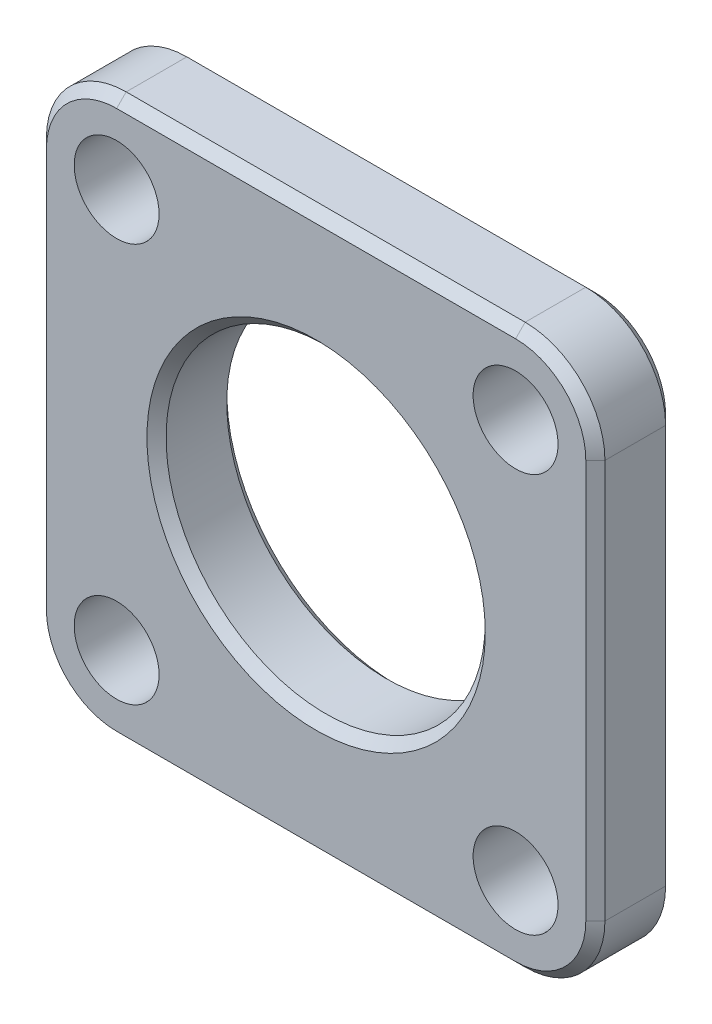
ISO-10303-21;
HEADER;
FILE_DESCRIPTION(('STEP AP214'),'2;1');
FILE_NAME('part.step','',(''),(''),'','','');
FILE_SCHEMA(('AUTOMOTIVE_DESIGN { 1 0 10303 214 1 1 1 1 }'));
ENDSEC;
DATA;
#1=APPLICATION_CONTEXT('core data for automotive mechanical design processes');
#2=APPLICATION_PROTOCOL_DEFINITION('international standard','automotive_design',2000,#1);
#3=PRODUCT_CONTEXT('',#1,'mechanical');
#4=PRODUCT('Part','Part','',(#3));
#5=PRODUCT_RELATED_PRODUCT_CATEGORY('part','',(#4));
#6=PRODUCT_DEFINITION_FORMATION('','',#4);
#7=PRODUCT_DEFINITION_CONTEXT('part definition',#1,'design');
#8=PRODUCT_DEFINITION('design','',#6,#7);
#9=PRODUCT_DEFINITION_SHAPE('','',#8);
#10=(LENGTH_UNIT() NAMED_UNIT(*) SI_UNIT(.MILLI.,.METRE.));
#11=(NAMED_UNIT(*) PLANE_ANGLE_UNIT() SI_UNIT($,.RADIAN.));
#12=(NAMED_UNIT(*) SI_UNIT($,.STERADIAN.) SOLID_ANGLE_UNIT());
#13=UNCERTAINTY_MEASURE_WITH_UNIT(LENGTH_MEASURE(1.E-05),#10,'distance_accuracy_value','');
#14=(GEOMETRIC_REPRESENTATION_CONTEXT(3) GLOBAL_UNCERTAINTY_ASSIGNED_CONTEXT((#13)) GLOBAL_UNIT_ASSIGNED_CONTEXT((#10,
#11,#12)) REPRESENTATION_CONTEXT('',''));
#15=CARTESIAN_POINT('',(0.,0.,0.));
#16=DIRECTION('',(0.,0.,1.));
#17=DIRECTION('',(1.,0.,0.));
#18=AXIS2_PLACEMENT_3D('',#15,#16,#17);
#19=CARTESIAN_POINT('',(0.,0.,-6.35));
#20=DIRECTION('',(0.,0.,1.));
#21=DIRECTION('',(1.,0.,0.));
#22=AXIS2_PLACEMENT_3D('',#19,#20,#21);
#23=PLANE('',#22);
#24=CARTESIAN_POINT('',(15.875,-15.875,-6.35));
#25=DIRECTION('',(0.,0.,1.));
#26=DIRECTION('',(1.,0.,0.));
#27=AXIS2_PLACEMENT_3D('',#24,#25,#26);
#28=CIRCLE('',#27,3.3782);
#29=CARTESIAN_POINT('',(19.2532,-15.875,-6.35));
#30=VERTEX_POINT('',#29);
#31=EDGE_CURVE('E392',#30,#30,#28,.T.);
#32=ORIENTED_EDGE('',*,*,#31,.T.);
#33=EDGE_LOOP('',(#32));
#34=FACE_BOUND('',#33,.T.);
#35=CARTESIAN_POINT('',(15.875,15.875,-6.35));
#36=DIRECTION('',(0.,0.,1.));
#37=DIRECTION('',(1.,0.,0.));
#38=AXIS2_PLACEMENT_3D('',#35,#36,#37);
#39=CIRCLE('',#38,3.3782);
#40=CARTESIAN_POINT('',(19.2532,15.875,-6.35));
#41=VERTEX_POINT('',#40);
#42=EDGE_CURVE('E256',#41,#41,#39,.F.);
#43=ORIENTED_EDGE('',*,*,#42,.F.);
#44=EDGE_LOOP('',(#43));
#45=FACE_BOUND('',#44,.T.);
#46=DIRECTION('',(0.,-1.,0.));
#47=VECTOR('',#46,1.);
#48=CARTESIAN_POINT('',(21.463,-15.875,-6.35));
#49=LINE('',#48,#47);
#50=CARTESIAN_POINT('',(21.463,15.875,-6.35));
#51=VERTEX_POINT('',#50);
#52=CARTESIAN_POINT('',(21.463,-15.875,-6.35));
#53=VERTEX_POINT('',#52);
#54=EDGE_CURVE('E175',#51,#53,#49,.T.);
#55=ORIENTED_EDGE('',*,*,#54,.T.);
#56=CARTESIAN_POINT('',(15.875,-15.875,-6.35));
#57=DIRECTION('',(0.,0.,1.));
#58=DIRECTION('',(1.,0.,0.));
#59=AXIS2_PLACEMENT_3D('',#56,#57,#58);
#60=CIRCLE('',#59,5.58799999999999);
#61=CARTESIAN_POINT('',(15.875,-21.463,-6.35));
#62=VERTEX_POINT('',#61);
#63=EDGE_CURVE('E156',#53,#62,#60,.F.);
#64=ORIENTED_EDGE('',*,*,#63,.T.);
#65=DIRECTION('',(-1.,0.,0.));
#66=VECTOR('',#65,1.);
#67=CARTESIAN_POINT('',(-15.875,-21.463,-6.35));
#68=LINE('',#67,#66);
#69=CARTESIAN_POINT('',(-15.875,-21.463,-6.35));
#70=VERTEX_POINT('',#69);
#71=EDGE_CURVE('E164',#62,#70,#68,.T.);
#72=ORIENTED_EDGE('',*,*,#71,.T.);
#73=CARTESIAN_POINT('',(-15.875,-15.875,-6.35));
#74=DIRECTION('',(0.,0.,1.));
#75=DIRECTION('',(1.,0.,0.));
#76=AXIS2_PLACEMENT_3D('',#73,#74,#75);
#77=CIRCLE('',#76,5.58799999999998);
#78=CARTESIAN_POINT('',(-21.463,-15.875,-6.35));
#79=VERTEX_POINT('',#78);
#80=EDGE_CURVE('E170',#70,#79,#77,.F.);
#81=ORIENTED_EDGE('',*,*,#80,.T.);
#82=DIRECTION('',(0.,1.,0.));
#83=VECTOR('',#82,1.);
#84=CARTESIAN_POINT('',(-21.463,15.875,-6.35));
#85=LINE('',#84,#83);
#86=CARTESIAN_POINT('',(-21.463,15.875,-6.35));
#87=VERTEX_POINT('',#86);
#88=EDGE_CURVE('E319',#79,#87,#85,.T.);
#89=ORIENTED_EDGE('',*,*,#88,.T.);
#90=CARTESIAN_POINT('',(-15.875,15.875,-6.35));
#91=DIRECTION('',(0.,0.,1.));
#92=DIRECTION('',(1.,0.,0.));
#93=AXIS2_PLACEMENT_3D('',#90,#91,#92);
#94=CIRCLE('',#93,5.58799999999999);
#95=CARTESIAN_POINT('',(-15.875,21.463,-6.35));
#96=VERTEX_POINT('',#95);
#97=EDGE_CURVE('E321',#87,#96,#94,.F.);
#98=ORIENTED_EDGE('',*,*,#97,.T.);
#99=DIRECTION('',(1.,0.,0.));
#100=VECTOR('',#99,1.);
#101=CARTESIAN_POINT('',(15.875,21.463,-6.35));
#102=LINE('',#101,#100);
#103=CARTESIAN_POINT('',(15.875,21.463,-6.35));
#104=VERTEX_POINT('',#103);
#105=EDGE_CURVE('E323',#96,#104,#102,.T.);
#106=ORIENTED_EDGE('',*,*,#105,.T.);
#107=CARTESIAN_POINT('',(15.875,15.875,-6.35));
#108=DIRECTION('',(0.,0.,1.));
#109=DIRECTION('',(1.,0.,0.));
#110=AXIS2_PLACEMENT_3D('',#107,#108,#109);
#111=CIRCLE('',#110,5.58799999999998);
#112=EDGE_CURVE('E180',#104,#51,#111,.F.);
#113=ORIENTED_EDGE('',*,*,#112,.T.);
#114=EDGE_LOOP('',(#55,#64,#72,#81,#89,#98,#106,#113));
#115=FACE_BOUND('',#114,.T.);
#116=CARTESIAN_POINT('',(0.,0.,-6.35));
#117=DIRECTION('',(0.,0.,1.));
#118=DIRECTION('',(1.,0.,0.));
#119=AXIS2_PLACEMENT_3D('',#116,#117,#118);
#120=CIRCLE('',#119,13.462);
#121=CARTESIAN_POINT('',(13.462,0.,-6.35));
#122=VERTEX_POINT('',#121);
#123=EDGE_CURVE('E171',#122,#122,#120,.T.);
#124=ORIENTED_EDGE('',*,*,#123,.T.);
#125=EDGE_LOOP('',(#124));
#126=FACE_BOUND('',#125,.T.);
#127=CARTESIAN_POINT('',(-15.875,-15.875,-6.35));
#128=DIRECTION('',(0.,0.,1.));
#129=DIRECTION('',(1.,0.,0.));
#130=AXIS2_PLACEMENT_3D('',#127,#128,#129);
#131=CIRCLE('',#130,3.3782);
#132=CARTESIAN_POINT('',(-12.4968,-15.875,-6.35));
#133=VERTEX_POINT('',#132);
#134=EDGE_CURVE('E386',#133,#133,#131,.F.);
#135=ORIENTED_EDGE('',*,*,#134,.F.);
#136=EDGE_LOOP('',(#135));
#137=FACE_BOUND('',#136,.T.);
#138=CARTESIAN_POINT('',(-15.875,15.875,-6.35));
#139=DIRECTION('',(0.,0.,1.));
#140=DIRECTION('',(1.,0.,0.));
#141=AXIS2_PLACEMENT_3D('',#138,#139,#140);
#142=CIRCLE('',#141,3.3782);
#143=CARTESIAN_POINT('',(-12.4968,15.875,-6.35));
#144=VERTEX_POINT('',#143);
#145=EDGE_CURVE('E380',#144,#144,#142,.T.);
#146=ORIENTED_EDGE('',*,*,#145,.T.);
#147=EDGE_LOOP('',(#146));
#148=FACE_BOUND('',#147,.T.);
#149=ADVANCED_FACE('F38',(#34,#45,#115,#126,#137,#148),#23,.F.);
#150=CARTESIAN_POINT('',(0.,0.,0.));
#151=DIRECTION('',(0.,0.,1.));
#152=DIRECTION('',(1.,0.,0.));
#153=AXIS2_PLACEMENT_3D('',#150,#151,#152);
#154=PLANE('',#153);
#155=CARTESIAN_POINT('',(-15.875,-15.875,0.));
#156=DIRECTION('',(0.,0.,1.));
#157=DIRECTION('',(1.,0.,0.));
#158=AXIS2_PLACEMENT_3D('',#155,#156,#157);
#159=CIRCLE('',#158,3.3782);
#160=CARTESIAN_POINT('',(-12.4968,-15.875,0.));
#161=VERTEX_POINT('',#160);
#162=EDGE_CURVE('E389',#161,#161,#159,.F.);
#163=ORIENTED_EDGE('',*,*,#162,.T.);
#164=EDGE_LOOP('',(#163));
#165=FACE_BOUND('',#164,.T.);
#166=CARTESIAN_POINT('',(15.875,15.875,0.));
#167=DIRECTION('',(0.,0.,1.));
#168=DIRECTION('',(1.,0.,0.));
#169=AXIS2_PLACEMENT_3D('',#166,#167,#168);
#170=CIRCLE('',#169,3.3782);
#171=CARTESIAN_POINT('',(19.2532,15.875,0.));
#172=VERTEX_POINT('',#171);
#173=EDGE_CURVE('E374',#172,#172,#170,.F.);
#174=ORIENTED_EDGE('',*,*,#173,.T.);
#175=EDGE_LOOP('',(#174));
#176=FACE_BOUND('',#175,.T.);
#177=DIRECTION('',(-1.,0.,0.));
#178=VECTOR('',#177,1.);
#179=CARTESIAN_POINT('',(0.,21.463,0.));
#180=LINE('',#179,#178);
#181=CARTESIAN_POINT('',(15.875,21.463,0.));
#182=VERTEX_POINT('',#181);
#183=CARTESIAN_POINT('',(-15.875,21.463,0.));
#184=VERTEX_POINT('',#183);
#185=EDGE_CURVE('E47',#182,#184,#180,.T.);
#186=ORIENTED_EDGE('',*,*,#185,.T.);
#187=CARTESIAN_POINT('',(-15.875,15.875,0.));
#188=DIRECTION('',(0.,0.,1.));
#189=DIRECTION('',(1.,0.,0.));
#190=AXIS2_PLACEMENT_3D('',#187,#188,#189);
#191=CIRCLE('',#190,5.588);
#192=CARTESIAN_POINT('',(-21.463,15.875,0.));
#193=VERTEX_POINT('',#192);
#194=EDGE_CURVE('E12',#184,#193,#191,.T.);
#195=ORIENTED_EDGE('',*,*,#194,.T.);
#196=DIRECTION('',(0.,-1.,0.));
#197=VECTOR('',#196,1.);
#198=CARTESIAN_POINT('',(-21.463,0.,0.));
#199=LINE('',#198,#197);
#200=CARTESIAN_POINT('',(-21.463,-15.875,0.));
#201=VERTEX_POINT('',#200);
#202=EDGE_CURVE('E223',#193,#201,#199,.T.);
#203=ORIENTED_EDGE('',*,*,#202,.T.);
#204=CARTESIAN_POINT('',(-15.875,-15.875,0.));
#205=DIRECTION('',(0.,0.,1.));
#206=DIRECTION('',(1.,0.,0.));
#207=AXIS2_PLACEMENT_3D('',#204,#205,#206);
#208=CIRCLE('',#207,5.58799999999999);
#209=CARTESIAN_POINT('',(-15.875,-21.463,0.));
#210=VERTEX_POINT('',#209);
#211=EDGE_CURVE('E225',#201,#210,#208,.T.);
#212=ORIENTED_EDGE('',*,*,#211,.T.);
#213=DIRECTION('',(1.,0.,0.));
#214=VECTOR('',#213,1.);
#215=CARTESIAN_POINT('',(0.,-21.463,0.));
#216=LINE('',#215,#214);
#217=CARTESIAN_POINT('',(15.875,-21.463,0.));
#218=VERTEX_POINT('',#217);
#219=EDGE_CURVE('E227',#210,#218,#216,.T.);
#220=ORIENTED_EDGE('',*,*,#219,.T.);
#221=CARTESIAN_POINT('',(15.875,-15.875,0.));
#222=DIRECTION('',(0.,0.,1.));
#223=DIRECTION('',(1.,0.,0.));
#224=AXIS2_PLACEMENT_3D('',#221,#222,#223);
#225=CIRCLE('',#224,5.588);
#226=CARTESIAN_POINT('',(21.463,-15.875,0.));
#227=VERTEX_POINT('',#226);
#228=EDGE_CURVE('E229',#218,#227,#225,.T.);
#229=ORIENTED_EDGE('',*,*,#228,.T.);
#230=DIRECTION('',(0.,1.,0.));
#231=VECTOR('',#230,1.);
#232=CARTESIAN_POINT('',(21.463,0.,0.));
#233=LINE('',#232,#231);
#234=CARTESIAN_POINT('',(21.463,15.875,0.));
#235=VERTEX_POINT('',#234);
#236=EDGE_CURVE('E231',#227,#235,#233,.T.);
#237=ORIENTED_EDGE('',*,*,#236,.T.);
#238=CARTESIAN_POINT('',(15.875,15.875,0.));
#239=DIRECTION('',(0.,0.,1.));
#240=DIRECTION('',(1.,0.,0.));
#241=AXIS2_PLACEMENT_3D('',#238,#239,#240);
#242=CIRCLE('',#241,5.58799999999999);
#243=EDGE_CURVE('E58',#235,#182,#242,.T.);
#244=ORIENTED_EDGE('',*,*,#243,.T.);
#245=EDGE_LOOP('',(#186,#195,#203,#212,#220,#229,#237,#244));
#246=FACE_BOUND('',#245,.T.);
#247=CARTESIAN_POINT('',(0.,0.,0.));
#248=DIRECTION('',(0.,0.,1.));
#249=DIRECTION('',(1.,0.,0.));
#250=AXIS2_PLACEMENT_3D('',#247,#248,#249);
#251=CIRCLE('',#250,13.462);
#252=CARTESIAN_POINT('',(13.462,0.,0.));
#253=VERTEX_POINT('',#252);
#254=EDGE_CURVE('E220',#253,#253,#251,.F.);
#255=ORIENTED_EDGE('',*,*,#254,.T.);
#256=EDGE_LOOP('',(#255));
#257=FACE_BOUND('',#256,.T.);
#258=CARTESIAN_POINT('',(15.875,-15.875,0.));
#259=DIRECTION('',(0.,0.,1.));
#260=DIRECTION('',(1.,0.,0.));
#261=AXIS2_PLACEMENT_3D('',#258,#259,#260);
#262=CIRCLE('',#261,3.3782);
#263=CARTESIAN_POINT('',(19.2532,-15.875,0.));
#264=VERTEX_POINT('',#263);
#265=EDGE_CURVE('E377',#264,#264,#262,.T.);
#266=ORIENTED_EDGE('',*,*,#265,.F.);
#267=EDGE_LOOP('',(#266));
#268=FACE_BOUND('',#267,.T.);
#269=CARTESIAN_POINT('',(-15.875,15.875,0.));
#270=DIRECTION('',(0.,0.,1.));
#271=DIRECTION('',(1.,0.,0.));
#272=AXIS2_PLACEMENT_3D('',#269,#270,#271);
#273=CIRCLE('',#272,3.3782);
#274=CARTESIAN_POINT('',(-12.4968,15.875,0.));
#275=VERTEX_POINT('',#274);
#276=EDGE_CURVE('E383',#275,#275,#273,.T.);
#277=ORIENTED_EDGE('',*,*,#276,.F.);
#278=EDGE_LOOP('',(#277));
#279=FACE_BOUND('',#278,.T.);
#280=ADVANCED_FACE('F352',(#165,#176,#246,#257,#268,#279),#154,.T.);
#281=CARTESIAN_POINT('',(-22.225,-22.225,-6.35));
#282=DIRECTION('',(-1.,0.,0.));
#283=DIRECTION('',(0.,0.,1.));
#284=AXIS2_PLACEMENT_3D('',#281,#282,#283);
#285=PLANE('',#284);
#286=DIRECTION('',(0.,0.,1.));
#287=VECTOR('',#286,1.);
#288=CARTESIAN_POINT('',(-22.225,15.875,-6.35));
#289=LINE('',#288,#287);
#290=CARTESIAN_POINT('',(-22.225,15.875,-0.762000000000013));
#291=VERTEX_POINT('',#290);
#292=CARTESIAN_POINT('',(-22.225,15.875,-5.58799999999999));
#293=VERTEX_POINT('',#292);
#294=EDGE_CURVE('E252',#291,#293,#289,.F.);
#295=ORIENTED_EDGE('',*,*,#294,.T.);
#296=DIRECTION('',(0.,-1.,0.));
#297=VECTOR('',#296,1.);
#298=CARTESIAN_POINT('',(-22.225,-15.875,-5.58799999999999));
#299=LINE('',#298,#297);
#300=CARTESIAN_POINT('',(-22.225,-15.875,-5.58799999999999));
#301=VERTEX_POINT('',#300);
#302=EDGE_CURVE('E204',#293,#301,#299,.T.);
#303=ORIENTED_EDGE('',*,*,#302,.T.);
#304=DIRECTION('',(0.,0.,1.));
#305=VECTOR('',#304,1.);
#306=CARTESIAN_POINT('',(-22.225,-15.875,-6.35));
#307=LINE('',#306,#305);
#308=CARTESIAN_POINT('',(-22.225,-15.875,-0.762000000000013));
#309=VERTEX_POINT('',#308);
#310=EDGE_CURVE('E299',#301,#309,#307,.T.);
#311=ORIENTED_EDGE('',*,*,#310,.T.);
#312=DIRECTION('',(0.,1.,0.));
#313=VECTOR('',#312,1.);
#314=CARTESIAN_POINT('',(-22.225,-22.225,-0.762000000000013));
#315=LINE('',#314,#313);
#316=EDGE_CURVE('E202',#309,#291,#315,.T.);
#317=ORIENTED_EDGE('',*,*,#316,.T.);
#318=EDGE_LOOP('',(#295,#303,#311,#317));
#319=FACE_BOUND('',#318,.T.);
#320=ADVANCED_FACE('F366',(#319),#285,.T.);
#321=CARTESIAN_POINT('',(22.225,22.225,-6.35));
#322=DIRECTION('',(0.,1.,0.));
#323=DIRECTION('',(-1.,0.,0.));
#324=AXIS2_PLACEMENT_3D('',#321,#322,#323);
#325=PLANE('',#324);
#326=DIRECTION('',(0.,0.,1.));
#327=VECTOR('',#326,1.);
#328=CARTESIAN_POINT('',(15.875,22.225,-6.35));
#329=LINE('',#328,#327);
#330=CARTESIAN_POINT('',(15.875,22.225,-0.762000000000013));
#331=VERTEX_POINT('',#330);
#332=CARTESIAN_POINT('',(15.875,22.225,-5.58799999999999));
#333=VERTEX_POINT('',#332);
#334=EDGE_CURVE('E301',#331,#333,#329,.F.);
#335=ORIENTED_EDGE('',*,*,#334,.T.);
#336=DIRECTION('',(-1.,0.,0.));
#337=VECTOR('',#336,1.);
#338=CARTESIAN_POINT('',(-15.875,22.225,-5.58799999999999));
#339=LINE('',#338,#337);
#340=CARTESIAN_POINT('',(-15.875,22.225,-5.58799999999999));
#341=VERTEX_POINT('',#340);
#342=EDGE_CURVE('E195',#333,#341,#339,.T.);
#343=ORIENTED_EDGE('',*,*,#342,.T.);
#344=DIRECTION('',(0.,0.,1.));
#345=VECTOR('',#344,1.);
#346=CARTESIAN_POINT('',(-15.875,22.225,-6.35));
#347=LINE('',#346,#345);
#348=CARTESIAN_POINT('',(-15.875,22.225,-0.762000000000013));
#349=VERTEX_POINT('',#348);
#350=EDGE_CURVE('E309',#341,#349,#347,.T.);
#351=ORIENTED_EDGE('',*,*,#350,.T.);
#352=DIRECTION('',(1.,0.,0.));
#353=VECTOR('',#352,1.);
#354=CARTESIAN_POINT('',(22.225,22.225,-0.762000000000013));
#355=LINE('',#354,#353);
#356=EDGE_CURVE('E193',#349,#331,#355,.T.);
#357=ORIENTED_EDGE('',*,*,#356,.T.);
#358=EDGE_LOOP('',(#335,#343,#351,#357));
#359=FACE_BOUND('',#358,.T.);
#360=ADVANCED_FACE('F427',(#359),#325,.T.);
#361=CARTESIAN_POINT('',(22.225,-22.225,-6.35));
#362=DIRECTION('',(1.,0.,0.));
#363=DIRECTION('',(0.,0.,-1.));
#364=AXIS2_PLACEMENT_3D('',#361,#362,#363);
#365=PLANE('',#364);
#366=DIRECTION('',(0.,0.,1.));
#367=VECTOR('',#366,1.);
#368=CARTESIAN_POINT('',(22.225,-15.875,-6.35));
#369=LINE('',#368,#367);
#370=CARTESIAN_POINT('',(22.225,-15.875,-0.762000000000013));
#371=VERTEX_POINT('',#370);
#372=CARTESIAN_POINT('',(22.225,-15.875,-5.58799999999999));
#373=VERTEX_POINT('',#372);
#374=EDGE_CURVE('E293',#371,#373,#369,.F.);
#375=ORIENTED_EDGE('',*,*,#374,.T.);
#376=DIRECTION('',(0.,1.,0.));
#377=VECTOR('',#376,1.);
#378=CARTESIAN_POINT('',(22.225,15.875,-5.58799999999999));
#379=LINE('',#378,#377);
#380=CARTESIAN_POINT('',(22.225,15.875,-5.58799999999999));
#381=VERTEX_POINT('',#380);
#382=EDGE_CURVE('E187',#373,#381,#379,.T.);
#383=ORIENTED_EDGE('',*,*,#382,.T.);
#384=DIRECTION('',(0.,0.,1.));
#385=VECTOR('',#384,1.);
#386=CARTESIAN_POINT('',(22.225,15.875,-6.35));
#387=LINE('',#386,#385);
#388=CARTESIAN_POINT('',(22.225,15.875,-0.762000000000013));
#389=VERTEX_POINT('',#388);
#390=EDGE_CURVE('E312',#381,#389,#387,.T.);
#391=ORIENTED_EDGE('',*,*,#390,.T.);
#392=DIRECTION('',(0.,-1.,0.));
#393=VECTOR('',#392,1.);
#394=CARTESIAN_POINT('',(22.225,-22.225,-0.762000000000013));
#395=LINE('',#394,#393);
#396=EDGE_CURVE('E185',#389,#371,#395,.T.);
#397=ORIENTED_EDGE('',*,*,#396,.T.);
#398=EDGE_LOOP('',(#375,#383,#391,#397));
#399=FACE_BOUND('',#398,.T.);
#400=ADVANCED_FACE('F336',(#399),#365,.T.);
#401=CARTESIAN_POINT('',(22.225,-22.225,-6.35));
#402=DIRECTION('',(0.,-1.,0.));
#403=DIRECTION('',(1.,0.,0.));
#404=AXIS2_PLACEMENT_3D('',#401,#402,#403);
#405=PLANE('',#404);
#406=DIRECTION('',(0.,0.,1.));
#407=VECTOR('',#406,1.);
#408=CARTESIAN_POINT('',(-15.875,-22.225,-6.35));
#409=LINE('',#408,#407);
#410=CARTESIAN_POINT('',(-15.875,-22.225,-0.762000000000013));
#411=VERTEX_POINT('',#410);
#412=CARTESIAN_POINT('',(-15.875,-22.225,-5.58799999999999));
#413=VERTEX_POINT('',#412);
#414=EDGE_CURVE('E298',#411,#413,#409,.F.);
#415=ORIENTED_EDGE('',*,*,#414,.T.);
#416=DIRECTION('',(1.,0.,0.));
#417=VECTOR('',#416,1.);
#418=CARTESIAN_POINT('',(15.875,-22.225,-5.58799999999999));
#419=LINE('',#418,#417);
#420=CARTESIAN_POINT('',(15.875,-22.225,-5.58799999999999));
#421=VERTEX_POINT('',#420);
#422=EDGE_CURVE('E212',#413,#421,#419,.T.);
#423=ORIENTED_EDGE('',*,*,#422,.T.);
#424=DIRECTION('',(0.,0.,1.));
#425=VECTOR('',#424,1.);
#426=CARTESIAN_POINT('',(15.875,-22.225,-6.35));
#427=LINE('',#426,#425);
#428=CARTESIAN_POINT('',(15.875,-22.225,-0.762000000000013));
#429=VERTEX_POINT('',#428);
#430=EDGE_CURVE('E291',#421,#429,#427,.T.);
#431=ORIENTED_EDGE('',*,*,#430,.T.);
#432=DIRECTION('',(-1.,0.,0.));
#433=VECTOR('',#432,1.);
#434=CARTESIAN_POINT('',(22.225,-22.225,-0.762000000000013));
#435=LINE('',#434,#433);
#436=EDGE_CURVE('E210',#429,#411,#435,.T.);
#437=ORIENTED_EDGE('',*,*,#436,.T.);
#438=EDGE_LOOP('',(#415,#423,#431,#437));
#439=FACE_BOUND('',#438,.T.);
#440=ADVANCED_FACE('F296',(#439),#405,.T.);
#441=CARTESIAN_POINT('',(0.,0.,-6.35));
#442=DIRECTION('',(0.,0.,1.));
#443=DIRECTION('',(1.,0.,0.));
#444=AXIS2_PLACEMENT_3D('',#441,#442,#443);
#445=CYLINDRICAL_SURFACE('',#444,12.7);
#446=CARTESIAN_POINT('',(0.,0.,-5.58799999999999));
#447=DIRECTION('',(0.,0.,1.));
#448=DIRECTION('',(1.,0.,0.));
#449=AXIS2_PLACEMENT_3D('',#446,#447,#448);
#450=CIRCLE('',#449,12.7);
#451=CARTESIAN_POINT('',(12.7,0.,-5.58799999999999));
#452=VERTEX_POINT('',#451);
#453=EDGE_CURVE('E217',#452,#452,#450,.F.);
#454=ORIENTED_EDGE('',*,*,#453,.T.);
#455=EDGE_LOOP('',(#454));
#456=FACE_BOUND('',#455,.T.);
#457=CARTESIAN_POINT('',(0.,0.,-0.762000000000006));
#458=DIRECTION('',(0.,0.,1.));
#459=DIRECTION('',(1.,0.,0.));
#460=AXIS2_PLACEMENT_3D('',#457,#458,#459);
#461=CIRCLE('',#460,12.7);
#462=CARTESIAN_POINT('',(12.7,0.,-0.762000000000006));
#463=VERTEX_POINT('',#462);
#464=EDGE_CURVE('E214',#463,#463,#461,.T.);
#465=ORIENTED_EDGE('',*,*,#464,.T.);
#466=EDGE_LOOP('',(#465));
#467=FACE_BOUND('',#466,.T.);
#468=ADVANCED_FACE('F425',(#456,#467),#445,.F.);
#469=CARTESIAN_POINT('',(-15.875,-15.875,-6.35));
#470=DIRECTION('',(0.,0.,1.));
#471=DIRECTION('',(1.,0.,0.));
#472=AXIS2_PLACEMENT_3D('',#469,#470,#471);
#473=CYLINDRICAL_SURFACE('',#472,6.35);
#474=ORIENTED_EDGE('',*,*,#310,.F.);
#475=CARTESIAN_POINT('',(-15.875,-15.875,-5.58799999999999));
#476=DIRECTION('',(0.,0.,1.));
#477=DIRECTION('',(1.,0.,0.));
#478=AXIS2_PLACEMENT_3D('',#475,#476,#477);
#479=CIRCLE('',#478,6.35);
#480=EDGE_CURVE('E208',#301,#413,#479,.T.);
#481=ORIENTED_EDGE('',*,*,#480,.T.);
#482=ORIENTED_EDGE('',*,*,#414,.F.);
#483=CARTESIAN_POINT('',(-15.875,-15.875,-0.762000000000013));
#484=DIRECTION('',(0.,0.,1.));
#485=DIRECTION('',(1.,0.,0.));
#486=AXIS2_PLACEMENT_3D('',#483,#484,#485);
#487=CIRCLE('',#486,6.35);
#488=EDGE_CURVE('E206',#411,#309,#487,.F.);
#489=ORIENTED_EDGE('',*,*,#488,.T.);
#490=EDGE_LOOP('',(#474,#481,#482,#489));
#491=FACE_BOUND('',#490,.T.);
#492=ADVANCED_FACE('F437',(#491),#473,.T.);
#493=CARTESIAN_POINT('',(-15.875,15.875,-6.35));
#494=DIRECTION('',(0.,0.,1.));
#495=DIRECTION('',(1.,0.,0.));
#496=AXIS2_PLACEMENT_3D('',#493,#494,#495);
#497=CYLINDRICAL_SURFACE('',#496,6.35);
#498=ORIENTED_EDGE('',*,*,#350,.F.);
#499=CARTESIAN_POINT('',(-15.875,15.875,-5.58799999999999));
#500=DIRECTION('',(0.,0.,1.));
#501=DIRECTION('',(1.,0.,0.));
#502=AXIS2_PLACEMENT_3D('',#499,#500,#501);
#503=CIRCLE('',#502,6.35);
#504=EDGE_CURVE('E200',#341,#293,#503,.T.);
#505=ORIENTED_EDGE('',*,*,#504,.T.);
#506=ORIENTED_EDGE('',*,*,#294,.F.);
#507=CARTESIAN_POINT('',(-15.875,15.875,-0.762000000000013));
#508=DIRECTION('',(0.,0.,1.));
#509=DIRECTION('',(1.,0.,0.));
#510=AXIS2_PLACEMENT_3D('',#507,#508,#509);
#511=CIRCLE('',#510,6.35);
#512=EDGE_CURVE('E197',#291,#349,#511,.F.);
#513=ORIENTED_EDGE('',*,*,#512,.T.);
#514=EDGE_LOOP('',(#498,#505,#506,#513));
#515=FACE_BOUND('',#514,.T.);
#516=ADVANCED_FACE('F371',(#515),#497,.T.);
#517=CARTESIAN_POINT('',(15.875,-15.875,-6.35));
#518=DIRECTION('',(0.,0.,1.));
#519=DIRECTION('',(1.,0.,0.));
#520=AXIS2_PLACEMENT_3D('',#517,#518,#519);
#521=CYLINDRICAL_SURFACE('',#520,6.35);
#522=ORIENTED_EDGE('',*,*,#430,.F.);
#523=CARTESIAN_POINT('',(15.875,-15.875,-5.58799999999999));
#524=DIRECTION('',(0.,0.,1.));
#525=DIRECTION('',(1.,0.,0.));
#526=AXIS2_PLACEMENT_3D('',#523,#524,#525);
#527=CIRCLE('',#526,6.35);
#528=EDGE_CURVE('E158',#421,#373,#527,.T.);
#529=ORIENTED_EDGE('',*,*,#528,.T.);
#530=ORIENTED_EDGE('',*,*,#374,.F.);
#531=CARTESIAN_POINT('',(15.875,-15.875,-0.762000000000013));
#532=DIRECTION('',(0.,0.,1.));
#533=DIRECTION('',(1.,0.,0.));
#534=AXIS2_PLACEMENT_3D('',#531,#532,#533);
#535=CIRCLE('',#534,6.35);
#536=EDGE_CURVE('E177',#371,#429,#535,.F.);
#537=ORIENTED_EDGE('',*,*,#536,.T.);
#538=EDGE_LOOP('',(#522,#529,#530,#537));
#539=FACE_BOUND('',#538,.T.);
#540=ADVANCED_FACE('F290',(#539),#521,.T.);
#541=CARTESIAN_POINT('',(15.875,15.875,-6.35));
#542=DIRECTION('',(0.,0.,1.));
#543=DIRECTION('',(1.,0.,0.));
#544=AXIS2_PLACEMENT_3D('',#541,#542,#543);
#545=CYLINDRICAL_SURFACE('',#544,6.35);
#546=ORIENTED_EDGE('',*,*,#390,.F.);
#547=CARTESIAN_POINT('',(15.875,15.875,-5.58799999999999));
#548=DIRECTION('',(0.,0.,1.));
#549=DIRECTION('',(1.,0.,0.));
#550=AXIS2_PLACEMENT_3D('',#547,#548,#549);
#551=CIRCLE('',#550,6.35);
#552=EDGE_CURVE('E191',#381,#333,#551,.T.);
#553=ORIENTED_EDGE('',*,*,#552,.T.);
#554=ORIENTED_EDGE('',*,*,#334,.F.);
#555=CARTESIAN_POINT('',(15.875,15.875,-0.762000000000013));
#556=DIRECTION('',(0.,0.,1.));
#557=DIRECTION('',(1.,0.,0.));
#558=AXIS2_PLACEMENT_3D('',#555,#556,#557);
#559=CIRCLE('',#558,6.35);
#560=EDGE_CURVE('E189',#331,#389,#559,.F.);
#561=ORIENTED_EDGE('',*,*,#560,.T.);
#562=EDGE_LOOP('',(#546,#553,#554,#561));
#563=FACE_BOUND('',#562,.T.);
#564=ADVANCED_FACE('F338',(#563),#545,.T.);
#565=CARTESIAN_POINT('',(-15.875,15.875,-6.35));
#566=DIRECTION('',(0.,0.,1.));
#567=DIRECTION('',(1.,0.,0.));
#568=AXIS2_PLACEMENT_3D('',#565,#566,#567);
#569=CONICAL_SURFACE('',#568,5.58799999999999,0.785398163397452);
#570=DIRECTION('',(0.707106781186551,0.,-0.707106781186544));
#571=VECTOR('',#570,1.);
#572=CARTESIAN_POINT('',(-22.225,15.875,-5.58799999999999));
#573=LINE('',#572,#571);
#574=EDGE_CURVE('E246',#293,#87,#573,.T.);
#575=ORIENTED_EDGE('',*,*,#574,.F.);
#576=ORIENTED_EDGE('',*,*,#504,.F.);
#577=DIRECTION('',(0.,0.707106781186551,0.707106781186544));
#578=VECTOR('',#577,1.);
#579=CARTESIAN_POINT('',(-15.875,21.463,-6.35));
#580=LINE('',#579,#578);
#581=EDGE_CURVE('E249',#96,#341,#580,.T.);
#582=ORIENTED_EDGE('',*,*,#581,.F.);
#583=ORIENTED_EDGE('',*,*,#97,.F.);
#584=EDGE_LOOP('',(#575,#576,#582,#583));
#585=FACE_BOUND('',#584,.T.);
#586=ADVANCED_FACE('F447',(#585),#569,.T.);
#587=CARTESIAN_POINT('',(22.225,22.225,-5.58799999999999));
#588=DIRECTION('',(0.,0.707106781186544,-0.707106781186551));
#589=DIRECTION('',(1.,0.,0.));
#590=AXIS2_PLACEMENT_3D('',#587,#588,#589);
#591=PLANE('',#590);
#592=ORIENTED_EDGE('',*,*,#581,.T.);
#593=ORIENTED_EDGE('',*,*,#342,.F.);
#594=DIRECTION('',(0.,0.707106781186551,0.707106781186544));
#595=VECTOR('',#594,1.);
#596=CARTESIAN_POINT('',(15.875,21.463,-6.35));
#597=LINE('',#596,#595);
#598=EDGE_CURVE('E243',#104,#333,#597,.T.);
#599=ORIENTED_EDGE('',*,*,#598,.F.);
#600=ORIENTED_EDGE('',*,*,#105,.F.);
#601=EDGE_LOOP('',(#592,#593,#599,#600));
#602=FACE_BOUND('',#601,.T.);
#603=ADVANCED_FACE('F464',(#602),#591,.T.);
#604=CARTESIAN_POINT('',(-22.225,-22.225,-5.58799999999999));
#605=DIRECTION('',(-0.707106781186544,0.,-0.707106781186551));
#606=DIRECTION('',(0.,1.,0.));
#607=AXIS2_PLACEMENT_3D('',#604,#605,#606);
#608=PLANE('',#607);
#609=ORIENTED_EDGE('',*,*,#574,.T.);
#610=ORIENTED_EDGE('',*,*,#88,.F.);
#611=DIRECTION('',(0.707106781186551,0.,-0.707106781186544));
#612=VECTOR('',#611,1.);
#613=CARTESIAN_POINT('',(-22.225,-15.875,-5.58799999999999));
#614=LINE('',#613,#612);
#615=EDGE_CURVE('E240',#301,#79,#614,.T.);
#616=ORIENTED_EDGE('',*,*,#615,.F.);
#617=ORIENTED_EDGE('',*,*,#302,.F.);
#618=EDGE_LOOP('',(#609,#610,#616,#617));
#619=FACE_BOUND('',#618,.T.);
#620=ADVANCED_FACE('F461',(#619),#608,.T.);
#621=CARTESIAN_POINT('',(15.875,15.875,-6.35));
#622=DIRECTION('',(0.,0.,1.));
#623=DIRECTION('',(1.,0.,0.));
#624=AXIS2_PLACEMENT_3D('',#621,#622,#623);
#625=CONICAL_SURFACE('',#624,5.58799999999998,0.785398163397454);
#626=ORIENTED_EDGE('',*,*,#598,.T.);
#627=ORIENTED_EDGE('',*,*,#552,.F.);
#628=DIRECTION('',(0.707106781186551,0.,0.707106781186544));
#629=VECTOR('',#628,1.);
#630=CARTESIAN_POINT('',(21.463,15.875,-6.35));
#631=LINE('',#630,#629);
#632=EDGE_CURVE('E237',#51,#381,#631,.T.);
#633=ORIENTED_EDGE('',*,*,#632,.F.);
#634=ORIENTED_EDGE('',*,*,#112,.F.);
#635=EDGE_LOOP('',(#626,#627,#633,#634));
#636=FACE_BOUND('',#635,.T.);
#637=ADVANCED_FACE('F330',(#636),#625,.T.);
#638=CARTESIAN_POINT('',(-15.875,-15.875,-6.35));
#639=DIRECTION('',(0.,0.,1.));
#640=DIRECTION('',(1.,0.,0.));
#641=AXIS2_PLACEMENT_3D('',#638,#639,#640);
#642=CONICAL_SURFACE('',#641,5.58799999999998,0.785398163397454);
#643=ORIENTED_EDGE('',*,*,#615,.T.);
#644=ORIENTED_EDGE('',*,*,#80,.F.);
#645=DIRECTION('',(0.,0.707106781186552,-0.707106781186543));
#646=VECTOR('',#645,1.);
#647=CARTESIAN_POINT('',(-15.875,-22.225,-5.58799999999999));
#648=LINE('',#647,#646);
#649=EDGE_CURVE('E167',#413,#70,#648,.T.);
#650=ORIENTED_EDGE('',*,*,#649,.F.);
#651=ORIENTED_EDGE('',*,*,#480,.F.);
#652=EDGE_LOOP('',(#643,#644,#650,#651));
#653=FACE_BOUND('',#652,.T.);
#654=ADVANCED_FACE('F455',(#653),#642,.T.);
#655=CARTESIAN_POINT('',(22.225,-22.225,-5.58799999999999));
#656=DIRECTION('',(0.707106781186544,0.,-0.707106781186551));
#657=DIRECTION('',(0.,-1.,0.));
#658=AXIS2_PLACEMENT_3D('',#655,#656,#657);
#659=PLANE('',#658);
#660=ORIENTED_EDGE('',*,*,#632,.T.);
#661=ORIENTED_EDGE('',*,*,#382,.F.);
#662=DIRECTION('',(0.707106781186551,0.,0.707106781186544));
#663=VECTOR('',#662,1.);
#664=CARTESIAN_POINT('',(21.463,-15.875,-6.35));
#665=LINE('',#664,#663);
#666=EDGE_CURVE('E161',#53,#373,#665,.T.);
#667=ORIENTED_EDGE('',*,*,#666,.F.);
#668=ORIENTED_EDGE('',*,*,#54,.F.);
#669=EDGE_LOOP('',(#660,#661,#667,#668));
#670=FACE_BOUND('',#669,.T.);
#671=ADVANCED_FACE('F333',(#670),#659,.T.);
#672=CARTESIAN_POINT('',(22.225,-22.225,-5.58799999999999));
#673=DIRECTION('',(0.,-0.707106781186544,-0.707106781186551));
#674=DIRECTION('',(-1.,0.,0.));
#675=AXIS2_PLACEMENT_3D('',#672,#673,#674);
#676=PLANE('',#675);
#677=ORIENTED_EDGE('',*,*,#649,.T.);
#678=ORIENTED_EDGE('',*,*,#71,.F.);
#679=DIRECTION('',(0.,0.707106781186549,-0.707106781186546));
#680=VECTOR('',#679,1.);
#681=CARTESIAN_POINT('',(15.875,-22.225,-5.58799999999999));
#682=LINE('',#681,#680);
#683=EDGE_CURVE('E152',#421,#62,#682,.T.);
#684=ORIENTED_EDGE('',*,*,#683,.F.);
#685=ORIENTED_EDGE('',*,*,#422,.F.);
#686=EDGE_LOOP('',(#677,#678,#684,#685));
#687=FACE_BOUND('',#686,.T.);
#688=ADVANCED_FACE('F165',(#687),#676,.T.);
#689=CARTESIAN_POINT('',(15.875,-15.875,-6.35));
#690=DIRECTION('',(0.,0.,1.));
#691=DIRECTION('',(1.,0.,0.));
#692=AXIS2_PLACEMENT_3D('',#689,#690,#691);
#693=CONICAL_SURFACE('',#692,5.58799999999999,0.785398163397452);
#694=ORIENTED_EDGE('',*,*,#666,.T.);
#695=ORIENTED_EDGE('',*,*,#528,.F.);
#696=ORIENTED_EDGE('',*,*,#683,.T.);
#697=ORIENTED_EDGE('',*,*,#63,.F.);
#698=EDGE_LOOP('',(#694,#695,#696,#697));
#699=FACE_BOUND('',#698,.T.);
#700=ADVANCED_FACE('F154',(#699),#693,.T.);
#701=CARTESIAN_POINT('',(0.,0.,-6.35));
#702=DIRECTION('',(0.,0.,-1.));
#703=DIRECTION('',(-1.,0.,0.));
#704=AXIS2_PLACEMENT_3D('',#701,#702,#703);
#705=CONICAL_SURFACE('',#704,13.462,0.785398163397445);
#706=ORIENTED_EDGE('',*,*,#453,.F.);
#707=EDGE_LOOP('',(#706));
#708=FACE_BOUND('',#707,.T.);
#709=ORIENTED_EDGE('',*,*,#123,.F.);
#710=EDGE_LOOP('',(#709));
#711=FACE_BOUND('',#710,.T.);
#712=ADVANCED_FACE('F450',(#708,#711),#705,.F.);
#713=CARTESIAN_POINT('',(15.875,-15.875,0.));
#714=DIRECTION('',(0.,0.,-1.));
#715=DIRECTION('',(-1.,0.,0.));
#716=AXIS2_PLACEMENT_3D('',#713,#714,#715);
#717=CONICAL_SURFACE('',#716,5.588,0.785398163397443);
#718=DIRECTION('',(0.,0.707106781186544,0.707106781186551));
#719=VECTOR('',#718,1.);
#720=CARTESIAN_POINT('',(15.875,-22.225,-0.762000000000013));
#721=LINE('',#720,#719);
#722=EDGE_CURVE('E269',#429,#218,#721,.T.);
#723=ORIENTED_EDGE('',*,*,#722,.F.);
#724=ORIENTED_EDGE('',*,*,#536,.F.);
#725=DIRECTION('',(0.707106781186544,0.,-0.707106781186551));
#726=VECTOR('',#725,1.);
#727=CARTESIAN_POINT('',(21.463,-15.875,0.));
#728=LINE('',#727,#726);
#729=EDGE_CURVE('E42',#227,#371,#728,.T.);
#730=ORIENTED_EDGE('',*,*,#729,.F.);
#731=ORIENTED_EDGE('',*,*,#228,.F.);
#732=EDGE_LOOP('',(#723,#724,#730,#731));
#733=FACE_BOUND('',#732,.T.);
#734=ADVANCED_FACE('F285',(#733),#717,.T.);
#735=CARTESIAN_POINT('',(21.463,0.,0.));
#736=DIRECTION('',(-0.707106781186551,0.,-0.707106781186544));
#737=DIRECTION('',(0.,1.,0.));
#738=AXIS2_PLACEMENT_3D('',#735,#736,#737);
#739=PLANE('',#738);
#740=ORIENTED_EDGE('',*,*,#729,.T.);
#741=ORIENTED_EDGE('',*,*,#396,.F.);
#742=DIRECTION('',(0.707106781186544,0.,-0.707106781186551));
#743=VECTOR('',#742,1.);
#744=CARTESIAN_POINT('',(21.463,15.875,0.));
#745=LINE('',#744,#743);
#746=EDGE_CURVE('E267',#235,#389,#745,.T.);
#747=ORIENTED_EDGE('',*,*,#746,.F.);
#748=ORIENTED_EDGE('',*,*,#236,.F.);
#749=EDGE_LOOP('',(#740,#741,#747,#748));
#750=FACE_BOUND('',#749,.T.);
#751=ADVANCED_FACE('F280',(#750),#739,.F.);
#752=CARTESIAN_POINT('',(0.,-21.463,0.));
#753=DIRECTION('',(0.,0.707106781186551,-0.707106781186544));
#754=DIRECTION('',(1.,0.,0.));
#755=AXIS2_PLACEMENT_3D('',#752,#753,#754);
#756=PLANE('',#755);
#757=ORIENTED_EDGE('',*,*,#722,.T.);
#758=ORIENTED_EDGE('',*,*,#219,.F.);
#759=DIRECTION('',(0.,0.707106781186546,0.707106781186549));
#760=VECTOR('',#759,1.);
#761=CARTESIAN_POINT('',(-15.875,-22.225,-0.762000000000013));
#762=LINE('',#761,#760);
#763=EDGE_CURVE('E264',#411,#210,#762,.T.);
#764=ORIENTED_EDGE('',*,*,#763,.F.);
#765=ORIENTED_EDGE('',*,*,#436,.F.);
#766=EDGE_LOOP('',(#757,#758,#764,#765));
#767=FACE_BOUND('',#766,.T.);
#768=ADVANCED_FACE('F485',(#767),#756,.F.);
#769=CARTESIAN_POINT('',(15.875,15.875,0.));
#770=DIRECTION('',(0.,0.,-1.));
#771=DIRECTION('',(-1.,0.,0.));
#772=AXIS2_PLACEMENT_3D('',#769,#770,#771);
#773=CONICAL_SURFACE('',#772,5.58799999999999,0.785398163397445);
#774=ORIENTED_EDGE('',*,*,#746,.T.);
#775=ORIENTED_EDGE('',*,*,#560,.F.);
#776=DIRECTION('',(0.,0.707106781186546,-0.707106781186549));
#777=VECTOR('',#776,1.);
#778=CARTESIAN_POINT('',(15.875,21.463,0.));
#779=LINE('',#778,#777);
#780=EDGE_CURVE('E261',#182,#331,#779,.T.);
#781=ORIENTED_EDGE('',*,*,#780,.F.);
#782=ORIENTED_EDGE('',*,*,#243,.F.);
#783=EDGE_LOOP('',(#774,#775,#781,#782));
#784=FACE_BOUND('',#783,.T.);
#785=ADVANCED_FACE('F342',(#784),#773,.T.);
#786=CARTESIAN_POINT('',(-15.875,-15.875,0.));
#787=DIRECTION('',(0.,0.,-1.));
#788=DIRECTION('',(-1.,0.,0.));
#789=AXIS2_PLACEMENT_3D('',#786,#787,#788);
#790=CONICAL_SURFACE('',#789,5.58799999999999,0.785398163397445);
#791=ORIENTED_EDGE('',*,*,#763,.T.);
#792=ORIENTED_EDGE('',*,*,#211,.F.);
#793=DIRECTION('',(0.707106781186546,0.,0.707106781186549));
#794=VECTOR('',#793,1.);
#795=CARTESIAN_POINT('',(-22.225,-15.875,-0.762000000000013));
#796=LINE('',#795,#794);
#797=EDGE_CURVE('E258',#309,#201,#796,.T.);
#798=ORIENTED_EDGE('',*,*,#797,.F.);
#799=ORIENTED_EDGE('',*,*,#488,.F.);
#800=EDGE_LOOP('',(#791,#792,#798,#799));
#801=FACE_BOUND('',#800,.T.);
#802=ADVANCED_FACE('F358',(#801),#790,.T.);
#803=CARTESIAN_POINT('',(0.,21.463,0.));
#804=DIRECTION('',(0.,-0.707106781186551,-0.707106781186544));
#805=DIRECTION('',(-1.,0.,0.));
#806=AXIS2_PLACEMENT_3D('',#803,#804,#805);
#807=PLANE('',#806);
#808=ORIENTED_EDGE('',*,*,#780,.T.);
#809=ORIENTED_EDGE('',*,*,#356,.F.);
#810=DIRECTION('',(0.,0.707106781186544,-0.707106781186551));
#811=VECTOR('',#810,1.);
#812=CARTESIAN_POINT('',(-15.875,21.463,0.));
#813=LINE('',#812,#811);
#814=EDGE_CURVE('E255',#184,#349,#813,.T.);
#815=ORIENTED_EDGE('',*,*,#814,.F.);
#816=ORIENTED_EDGE('',*,*,#185,.F.);
#817=EDGE_LOOP('',(#808,#809,#815,#816));
#818=FACE_BOUND('',#817,.T.);
#819=ADVANCED_FACE('F345',(#818),#807,.F.);
#820=CARTESIAN_POINT('',(-21.463,0.,0.));
#821=DIRECTION('',(0.707106781186551,0.,-0.707106781186544));
#822=DIRECTION('',(0.,-1.,0.));
#823=AXIS2_PLACEMENT_3D('',#820,#821,#822);
#824=PLANE('',#823);
#825=ORIENTED_EDGE('',*,*,#797,.T.);
#826=ORIENTED_EDGE('',*,*,#202,.F.);
#827=DIRECTION('',(0.707106781186544,0.,0.707106781186551));
#828=VECTOR('',#827,1.);
#829=CARTESIAN_POINT('',(-22.225,15.875,-0.762000000000013));
#830=LINE('',#829,#828);
#831=EDGE_CURVE('E253',#291,#193,#830,.T.);
#832=ORIENTED_EDGE('',*,*,#831,.F.);
#833=ORIENTED_EDGE('',*,*,#316,.F.);
#834=EDGE_LOOP('',(#825,#826,#832,#833));
#835=FACE_BOUND('',#834,.T.);
#836=ADVANCED_FACE('F362',(#835),#824,.F.);
#837=CARTESIAN_POINT('',(-15.875,15.875,0.));
#838=DIRECTION('',(0.,0.,-1.));
#839=DIRECTION('',(-1.,0.,0.));
#840=AXIS2_PLACEMENT_3D('',#837,#838,#839);
#841=CONICAL_SURFACE('',#840,5.588,0.785398163397443);
#842=ORIENTED_EDGE('',*,*,#814,.T.);
#843=ORIENTED_EDGE('',*,*,#512,.F.);
#844=ORIENTED_EDGE('',*,*,#831,.T.);
#845=ORIENTED_EDGE('',*,*,#194,.F.);
#846=EDGE_LOOP('',(#842,#843,#844,#845));
#847=FACE_BOUND('',#846,.T.);
#848=ADVANCED_FACE('F349',(#847),#841,.T.);
#849=CARTESIAN_POINT('',(0.,0.,-0.762000000000006));
#850=DIRECTION('',(0.,0.,1.));
#851=DIRECTION('',(1.,0.,0.));
#852=AXIS2_PLACEMENT_3D('',#849,#850,#851);
#853=CONICAL_SURFACE('',#852,12.7,0.785398163397447);
#854=ORIENTED_EDGE('',*,*,#254,.F.);
#855=EDGE_LOOP('',(#854));
#856=FACE_BOUND('',#855,.T.);
#857=ORIENTED_EDGE('',*,*,#464,.F.);
#858=EDGE_LOOP('',(#857));
#859=FACE_BOUND('',#858,.T.);
#860=ADVANCED_FACE('F40',(#856,#859),#853,.F.);
#861=CARTESIAN_POINT('',(15.875,15.875,-6.35));
#862=DIRECTION('',(0.,0.,1.));
#863=DIRECTION('',(1.,0.,0.));
#864=AXIS2_PLACEMENT_3D('',#861,#862,#863);
#865=CYLINDRICAL_SURFACE('',#864,3.3782);
#866=ORIENTED_EDGE('',*,*,#42,.T.);
#867=EDGE_LOOP('',(#866));
#868=FACE_BOUND('',#867,.T.);
#869=ORIENTED_EDGE('',*,*,#173,.F.);
#870=EDGE_LOOP('',(#869));
#871=FACE_BOUND('',#870,.T.);
#872=ADVANCED_FACE('F528',(#868,#871),#865,.F.);
#873=CARTESIAN_POINT('',(15.875,-15.875,-6.35));
#874=DIRECTION('',(0.,0.,1.));
#875=DIRECTION('',(1.,0.,0.));
#876=AXIS2_PLACEMENT_3D('',#873,#874,#875);
#877=CYLINDRICAL_SURFACE('',#876,3.3782);
#878=ORIENTED_EDGE('',*,*,#31,.F.);
#879=EDGE_LOOP('',(#878));
#880=FACE_BOUND('',#879,.T.);
#881=ORIENTED_EDGE('',*,*,#265,.T.);
#882=EDGE_LOOP('',(#881));
#883=FACE_BOUND('',#882,.T.);
#884=ADVANCED_FACE('F398',(#880,#883),#877,.F.);
#885=CARTESIAN_POINT('',(-15.875,-15.875,-6.35));
#886=DIRECTION('',(0.,0.,1.));
#887=DIRECTION('',(1.,0.,0.));
#888=AXIS2_PLACEMENT_3D('',#885,#886,#887);
#889=CYLINDRICAL_SURFACE('',#888,3.3782);
#890=ORIENTED_EDGE('',*,*,#134,.T.);
#891=EDGE_LOOP('',(#890));
#892=FACE_BOUND('',#891,.T.);
#893=ORIENTED_EDGE('',*,*,#162,.F.);
#894=EDGE_LOOP('',(#893));
#895=FACE_BOUND('',#894,.T.);
#896=ADVANCED_FACE('F408',(#892,#895),#889,.F.);
#897=CARTESIAN_POINT('',(-15.875,15.875,-6.35));
#898=DIRECTION('',(0.,0.,1.));
#899=DIRECTION('',(1.,0.,0.));
#900=AXIS2_PLACEMENT_3D('',#897,#898,#899);
#901=CYLINDRICAL_SURFACE('',#900,3.3782);
#902=ORIENTED_EDGE('',*,*,#145,.F.);
#903=EDGE_LOOP('',(#902));
#904=FACE_BOUND('',#903,.T.);
#905=ORIENTED_EDGE('',*,*,#276,.T.);
#906=EDGE_LOOP('',(#905));
#907=FACE_BOUND('',#906,.T.);
#908=ADVANCED_FACE('F406',(#904,#907),#901,.F.);
#909=CLOSED_SHELL('',(#149,#280,#320,#360,#400,#440,#468,#492,#516,#540,#564,#586,#603,#620,
#637,#654,#671,#688,#700,#712,#734,#751,#768,#785,#802,#819,#836,#848,#860,#872,#884,#896,#908));
#910=MANIFOLD_SOLID_BREP('B2',#909);
#911=ADVANCED_BREP_SHAPE_REPRESENTATION('',(#18,#910),#14);
#912=SHAPE_DEFINITION_REPRESENTATION(#9,#911);
ENDSEC;
END-ISO-10303-21;
